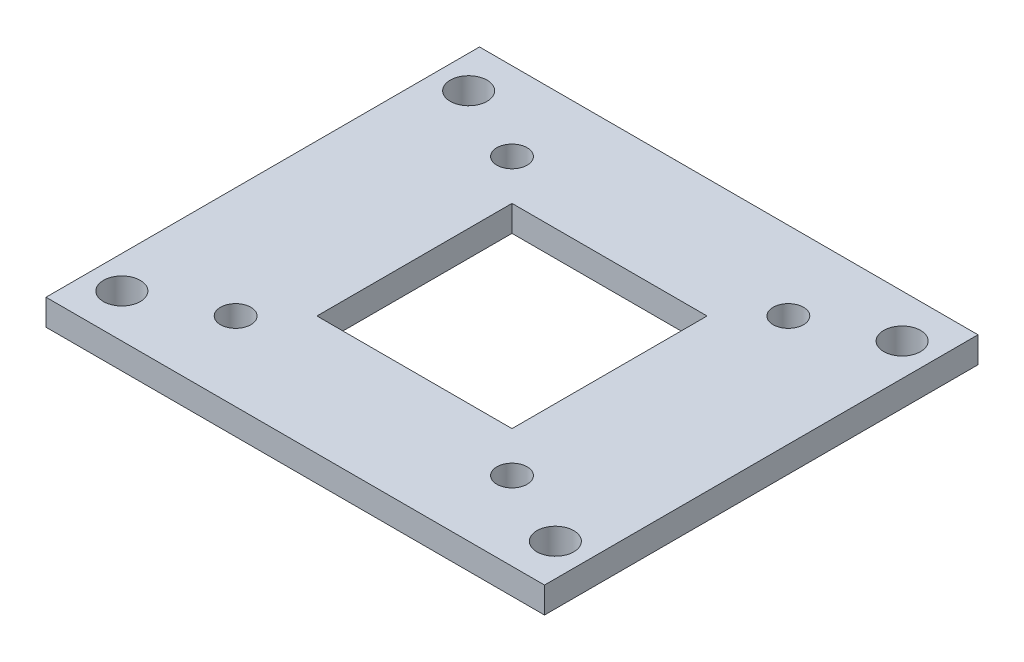
ISO-10303-21;
HEADER;
FILE_DESCRIPTION(('STEP AP214'),'2;1');
FILE_NAME('part.step','',(''),(''),'','','');
FILE_SCHEMA(('AUTOMOTIVE_DESIGN { 1 0 10303 214 1 1 1 1 }'));
ENDSEC;
DATA;
#1=APPLICATION_CONTEXT('core data for automotive mechanical design processes');
#2=APPLICATION_PROTOCOL_DEFINITION('international standard','automotive_design',2000,#1);
#3=PRODUCT_CONTEXT('',#1,'mechanical');
#4=PRODUCT('Part','Part','',(#3));
#5=PRODUCT_RELATED_PRODUCT_CATEGORY('part','',(#4));
#6=PRODUCT_DEFINITION_FORMATION('','',#4);
#7=PRODUCT_DEFINITION_CONTEXT('part definition',#1,'design');
#8=PRODUCT_DEFINITION('design','',#6,#7);
#9=PRODUCT_DEFINITION_SHAPE('','',#8);
#10=(LENGTH_UNIT() NAMED_UNIT(*) SI_UNIT(.MILLI.,.METRE.));
#11=(NAMED_UNIT(*) PLANE_ANGLE_UNIT() SI_UNIT($,.RADIAN.));
#12=(NAMED_UNIT(*) SI_UNIT($,.STERADIAN.) SOLID_ANGLE_UNIT());
#13=UNCERTAINTY_MEASURE_WITH_UNIT(LENGTH_MEASURE(1.E-05),#10,'distance_accuracy_value','');
#14=(GEOMETRIC_REPRESENTATION_CONTEXT(3) GLOBAL_UNCERTAINTY_ASSIGNED_CONTEXT((#13)) GLOBAL_UNIT_ASSIGNED_CONTEXT((#10,
#11,#12)) REPRESENTATION_CONTEXT('',''));
#15=CARTESIAN_POINT('',(0.,0.,0.));
#16=DIRECTION('',(0.,0.,1.));
#17=DIRECTION('',(1.,0.,0.));
#18=AXIS2_PLACEMENT_3D('',#15,#16,#17);
#19=CARTESIAN_POINT('',(-23.,-22.,-53.));
#20=DIRECTION('',(0.,1.,0.));
#21=DIRECTION('',(0.,0.,1.));
#22=AXIS2_PLACEMENT_3D('',#19,#20,#21);
#23=PLANE('',#22);
#24=CARTESIAN_POINT('',(20.,-22.,-17.));
#25=DIRECTION('',(0.,1.,0.));
#26=DIRECTION('',(0.,0.,1.));
#27=AXIS2_PLACEMENT_3D('',#24,#25,#26);
#28=CIRCLE('',#27,1.7);
#29=CARTESIAN_POINT('',(20.,-22.,-15.3));
#30=VERTEX_POINT('',#29);
#31=EDGE_CURVE('E126',#30,#30,#28,.F.);
#32=ORIENTED_EDGE('',*,*,#31,.T.);
#33=EDGE_LOOP('',(#32));
#34=FACE_BOUND('',#33,.T.);
#35=CARTESIAN_POINT('',(12.75,-22.,-20.25));
#36=DIRECTION('',(0.,1.,0.));
#37=DIRECTION('',(0.,0.,1.));
#38=AXIS2_PLACEMENT_3D('',#35,#36,#37);
#39=CIRCLE('',#38,1.4);
#40=CARTESIAN_POINT('',(12.75,-22.,-18.85));
#41=VERTEX_POINT('',#40);
#42=EDGE_CURVE('E129',#41,#41,#39,.F.);
#43=ORIENTED_EDGE('',*,*,#42,.T.);
#44=EDGE_LOOP('',(#43));
#45=FACE_BOUND('',#44,.T.);
#46=CARTESIAN_POINT('',(20.,-22.,-49.));
#47=DIRECTION('',(0.,1.,0.));
#48=DIRECTION('',(0.,0.,1.));
#49=AXIS2_PLACEMENT_3D('',#46,#47,#48);
#50=CIRCLE('',#49,1.7);
#51=CARTESIAN_POINT('',(20.,-22.,-47.3));
#52=VERTEX_POINT('',#51);
#53=EDGE_CURVE('E132',#52,#52,#50,.F.);
#54=ORIENTED_EDGE('',*,*,#53,.T.);
#55=EDGE_LOOP('',(#54));
#56=FACE_BOUND('',#55,.T.);
#57=CARTESIAN_POINT('',(12.75,-22.,-45.75));
#58=DIRECTION('',(0.,1.,0.));
#59=DIRECTION('',(0.,0.,1.));
#60=AXIS2_PLACEMENT_3D('',#57,#58,#59);
#61=CIRCLE('',#60,1.4);
#62=CARTESIAN_POINT('',(12.75,-22.,-44.35));
#63=VERTEX_POINT('',#62);
#64=EDGE_CURVE('E135',#63,#63,#61,.F.);
#65=ORIENTED_EDGE('',*,*,#64,.T.);
#66=EDGE_LOOP('',(#65));
#67=FACE_BOUND('',#66,.T.);
#68=CARTESIAN_POINT('',(-12.75,-22.,-20.25));
#69=DIRECTION('',(0.,1.,0.));
#70=DIRECTION('',(0.,0.,1.));
#71=AXIS2_PLACEMENT_3D('',#68,#69,#70);
#72=CIRCLE('',#71,1.4);
#73=CARTESIAN_POINT('',(-12.75,-22.,-18.85));
#74=VERTEX_POINT('',#73);
#75=EDGE_CURVE('E138',#74,#74,#72,.F.);
#76=ORIENTED_EDGE('',*,*,#75,.T.);
#77=EDGE_LOOP('',(#76));
#78=FACE_BOUND('',#77,.T.);
#79=CARTESIAN_POINT('',(-20.,-22.,-17.));
#80=DIRECTION('',(0.,1.,0.));
#81=DIRECTION('',(0.,0.,1.));
#82=AXIS2_PLACEMENT_3D('',#79,#80,#81);
#83=CIRCLE('',#82,1.7);
#84=CARTESIAN_POINT('',(-20.,-22.,-15.3));
#85=VERTEX_POINT('',#84);
#86=EDGE_CURVE('E141',#85,#85,#83,.F.);
#87=ORIENTED_EDGE('',*,*,#86,.T.);
#88=EDGE_LOOP('',(#87));
#89=FACE_BOUND('',#88,.T.);
#90=DIRECTION('',(1.,0.,0.));
#91=VECTOR('',#90,1.);
#92=CARTESIAN_POINT('',(-9.,-22.,-42.));
#93=LINE('',#92,#91);
#94=CARTESIAN_POINT('',(9.,-22.,-42.));
#95=VERTEX_POINT('',#94);
#96=CARTESIAN_POINT('',(-9.,-22.,-42.));
#97=VERTEX_POINT('',#96);
#98=EDGE_CURVE('E185',#95,#97,#93,.F.);
#99=ORIENTED_EDGE('',*,*,#98,.F.);
#100=DIRECTION('',(0.,0.,-1.));
#101=VECTOR('',#100,1.);
#102=CARTESIAN_POINT('',(9.,-22.,-42.));
#103=LINE('',#102,#101);
#104=CARTESIAN_POINT('',(9.,-22.,-24.));
#105=VERTEX_POINT('',#104);
#106=EDGE_CURVE('E143',#95,#105,#103,.F.);
#107=ORIENTED_EDGE('',*,*,#106,.T.);
#108=DIRECTION('',(1.,0.,0.));
#109=VECTOR('',#108,1.);
#110=CARTESIAN_POINT('',(-9.,-22.,-24.));
#111=LINE('',#110,#109);
#112=CARTESIAN_POINT('',(-9.,-22.,-24.));
#113=VERTEX_POINT('',#112);
#114=EDGE_CURVE('E146',#105,#113,#111,.F.);
#115=ORIENTED_EDGE('',*,*,#114,.T.);
#116=DIRECTION('',(0.,0.,-1.));
#117=VECTOR('',#116,1.);
#118=CARTESIAN_POINT('',(-9.,-22.,-42.));
#119=LINE('',#118,#117);
#120=EDGE_CURVE('E190',#97,#113,#119,.F.);
#121=ORIENTED_EDGE('',*,*,#120,.F.);
#122=EDGE_LOOP('',(#99,#107,#115,#121));
#123=FACE_BOUND('',#122,.T.);
#124=CARTESIAN_POINT('',(-12.75,-22.,-45.75));
#125=DIRECTION('',(0.,1.,0.));
#126=DIRECTION('',(0.,0.,1.));
#127=AXIS2_PLACEMENT_3D('',#124,#125,#126);
#128=CIRCLE('',#127,1.4);
#129=CARTESIAN_POINT('',(-12.75,-22.,-44.35));
#130=VERTEX_POINT('',#129);
#131=EDGE_CURVE('E144',#130,#130,#128,.F.);
#132=ORIENTED_EDGE('',*,*,#131,.T.);
#133=EDGE_LOOP('',(#132));
#134=FACE_BOUND('',#133,.T.);
#135=CARTESIAN_POINT('',(-20.,-22.,-49.));
#136=DIRECTION('',(0.,1.,0.));
#137=DIRECTION('',(0.,0.,1.));
#138=AXIS2_PLACEMENT_3D('',#135,#136,#137);
#139=CIRCLE('',#138,1.7);
#140=CARTESIAN_POINT('',(-20.,-22.,-47.3));
#141=VERTEX_POINT('',#140);
#142=EDGE_CURVE('E18',#141,#141,#139,.F.);
#143=ORIENTED_EDGE('',*,*,#142,.T.);
#144=EDGE_LOOP('',(#143));
#145=FACE_BOUND('',#144,.T.);
#146=DIRECTION('',(1.,0.,0.));
#147=VECTOR('',#146,1.);
#148=CARTESIAN_POINT('',(-23.,-22.,-13.));
#149=LINE('',#148,#147);
#150=CARTESIAN_POINT('',(23.,-22.,-13.));
#151=VERTEX_POINT('',#150);
#152=CARTESIAN_POINT('',(-23.,-22.,-13.));
#153=VERTEX_POINT('',#152);
#154=EDGE_CURVE('E165',#151,#153,#149,.F.);
#155=ORIENTED_EDGE('',*,*,#154,.F.);
#156=DIRECTION('',(0.,0.,-1.));
#157=VECTOR('',#156,1.);
#158=CARTESIAN_POINT('',(23.,-22.,-53.));
#159=LINE('',#158,#157);
#160=CARTESIAN_POINT('',(23.,-22.,-53.));
#161=VERTEX_POINT('',#160);
#162=EDGE_CURVE('E83',#161,#151,#159,.F.);
#163=ORIENTED_EDGE('',*,*,#162,.F.);
#164=DIRECTION('',(1.,0.,0.));
#165=VECTOR('',#164,1.);
#166=CARTESIAN_POINT('',(-23.,-22.,-53.));
#167=LINE('',#166,#165);
#168=CARTESIAN_POINT('',(-23.,-22.,-53.));
#169=VERTEX_POINT('',#168);
#170=EDGE_CURVE('E82',#161,#169,#167,.F.);
#171=ORIENTED_EDGE('',*,*,#170,.T.);
#172=DIRECTION('',(0.,0.,-1.));
#173=VECTOR('',#172,1.);
#174=CARTESIAN_POINT('',(-23.,-22.,-53.));
#175=LINE('',#174,#173);
#176=EDGE_CURVE('E79',#169,#153,#175,.F.);
#177=ORIENTED_EDGE('',*,*,#176,.T.);
#178=EDGE_LOOP('',(#155,#163,#171,#177));
#179=FACE_BOUND('',#178,.T.);
#180=ADVANCED_FACE('F15',(#34,#45,#56,#67,#78,#89,#123,#134,#145,#179),#23,.T.);
#181=CARTESIAN_POINT('',(-23.,-24.4,-53.));
#182=DIRECTION('',(0.,0.,1.));
#183=DIRECTION('',(1.,0.,0.));
#184=AXIS2_PLACEMENT_3D('',#181,#182,#183);
#185=PLANE('',#184);
#186=DIRECTION('',(0.,1.,0.));
#187=VECTOR('',#186,1.);
#188=CARTESIAN_POINT('',(23.,-24.4,-53.));
#189=LINE('',#188,#187);
#190=CARTESIAN_POINT('',(23.,-24.4,-53.));
#191=VERTEX_POINT('',#190);
#192=EDGE_CURVE('E160',#191,#161,#189,.T.);
#193=ORIENTED_EDGE('',*,*,#192,.F.);
#194=DIRECTION('',(1.,0.,0.));
#195=VECTOR('',#194,1.);
#196=CARTESIAN_POINT('',(-23.,-24.4,-53.));
#197=LINE('',#196,#195);
#198=CARTESIAN_POINT('',(-23.,-24.4,-53.));
#199=VERTEX_POINT('',#198);
#200=EDGE_CURVE('E99',#191,#199,#197,.F.);
#201=ORIENTED_EDGE('',*,*,#200,.T.);
#202=DIRECTION('',(0.,1.,0.));
#203=VECTOR('',#202,1.);
#204=CARTESIAN_POINT('',(-23.,-24.4,-53.));
#205=LINE('',#204,#203);
#206=EDGE_CURVE('E88',#199,#169,#205,.T.);
#207=ORIENTED_EDGE('',*,*,#206,.T.);
#208=ORIENTED_EDGE('',*,*,#170,.F.);
#209=EDGE_LOOP('',(#193,#201,#207,#208));
#210=FACE_BOUND('',#209,.T.);
#211=ADVANCED_FACE('F98',(#210),#185,.F.);
#212=CARTESIAN_POINT('',(-23.,-24.4,-53.));
#213=DIRECTION('',(1.,0.,0.));
#214=DIRECTION('',(0.,0.,-1.));
#215=AXIS2_PLACEMENT_3D('',#212,#213,#214);
#216=PLANE('',#215);
#217=ORIENTED_EDGE('',*,*,#176,.F.);
#218=ORIENTED_EDGE('',*,*,#206,.F.);
#219=DIRECTION('',(0.,0.,1.));
#220=VECTOR('',#219,1.);
#221=CARTESIAN_POINT('',(-23.,-24.4,-53.));
#222=LINE('',#221,#220);
#223=CARTESIAN_POINT('',(-23.,-24.4,-13.));
#224=VERTEX_POINT('',#223);
#225=EDGE_CURVE('E173',#199,#224,#222,.T.);
#226=ORIENTED_EDGE('',*,*,#225,.T.);
#227=DIRECTION('',(0.,1.,0.));
#228=VECTOR('',#227,1.);
#229=CARTESIAN_POINT('',(-23.,-24.4,-13.));
#230=LINE('',#229,#228);
#231=EDGE_CURVE('E95',#153,#224,#230,.F.);
#232=ORIENTED_EDGE('',*,*,#231,.F.);
#233=EDGE_LOOP('',(#217,#218,#226,#232));
#234=FACE_BOUND('',#233,.T.);
#235=ADVANCED_FACE('F92',(#234),#216,.F.);
#236=CARTESIAN_POINT('',(-23.,-24.4,-13.));
#237=DIRECTION('',(0.,0.,1.));
#238=DIRECTION('',(1.,0.,0.));
#239=AXIS2_PLACEMENT_3D('',#236,#237,#238);
#240=PLANE('',#239);
#241=DIRECTION('',(0.,1.,0.));
#242=VECTOR('',#241,1.);
#243=CARTESIAN_POINT('',(23.,-24.4,-13.));
#244=LINE('',#243,#242);
#245=CARTESIAN_POINT('',(23.,-24.4,-13.));
#246=VERTEX_POINT('',#245);
#247=EDGE_CURVE('E152',#151,#246,#244,.F.);
#248=ORIENTED_EDGE('',*,*,#247,.F.);
#249=ORIENTED_EDGE('',*,*,#154,.T.);
#250=ORIENTED_EDGE('',*,*,#231,.T.);
#251=DIRECTION('',(1.,0.,0.));
#252=VECTOR('',#251,1.);
#253=CARTESIAN_POINT('',(-23.,-24.4,-13.));
#254=LINE('',#253,#252);
#255=EDGE_CURVE('E170',#224,#246,#254,.T.);
#256=ORIENTED_EDGE('',*,*,#255,.T.);
#257=EDGE_LOOP('',(#248,#249,#250,#256));
#258=FACE_BOUND('',#257,.T.);
#259=ADVANCED_FACE('F169',(#258),#240,.T.);
#260=CARTESIAN_POINT('',(23.,-24.4,-53.));
#261=DIRECTION('',(1.,0.,0.));
#262=DIRECTION('',(0.,0.,-1.));
#263=AXIS2_PLACEMENT_3D('',#260,#261,#262);
#264=PLANE('',#263);
#265=ORIENTED_EDGE('',*,*,#162,.T.);
#266=ORIENTED_EDGE('',*,*,#247,.T.);
#267=DIRECTION('',(0.,0.,1.));
#268=VECTOR('',#267,1.);
#269=CARTESIAN_POINT('',(23.,-24.4,-53.));
#270=LINE('',#269,#268);
#271=EDGE_CURVE('E125',#246,#191,#270,.F.);
#272=ORIENTED_EDGE('',*,*,#271,.T.);
#273=ORIENTED_EDGE('',*,*,#192,.T.);
#274=EDGE_LOOP('',(#265,#266,#272,#273));
#275=FACE_BOUND('',#274,.T.);
#276=ADVANCED_FACE('F211',(#275),#264,.T.);
#277=CARTESIAN_POINT('',(-20.,-20.,-49.));
#278=DIRECTION('',(0.,1.,0.));
#279=DIRECTION('',(0.,0.,1.));
#280=AXIS2_PLACEMENT_3D('',#277,#278,#279);
#281=CYLINDRICAL_SURFACE('',#280,1.7);
#282=CARTESIAN_POINT('',(-20.,-24.4,-49.));
#283=DIRECTION('',(0.,1.,0.));
#284=DIRECTION('',(0.,0.,1.));
#285=AXIS2_PLACEMENT_3D('',#282,#283,#284);
#286=CIRCLE('',#285,1.7);
#287=CARTESIAN_POINT('',(-20.,-24.4,-47.3));
#288=VERTEX_POINT('',#287);
#289=EDGE_CURVE('E122',#288,#288,#286,.F.);
#290=ORIENTED_EDGE('',*,*,#289,.T.);
#291=EDGE_LOOP('',(#290));
#292=FACE_BOUND('',#291,.T.);
#293=ORIENTED_EDGE('',*,*,#142,.F.);
#294=EDGE_LOOP('',(#293));
#295=FACE_BOUND('',#294,.T.);
#296=ADVANCED_FACE('F213',(#292,#295),#281,.F.);
#297=CARTESIAN_POINT('',(-12.75,-20.,-45.75));
#298=DIRECTION('',(0.,1.,0.));
#299=DIRECTION('',(0.,0.,1.));
#300=AXIS2_PLACEMENT_3D('',#297,#298,#299);
#301=CYLINDRICAL_SURFACE('',#300,1.4);
#302=CARTESIAN_POINT('',(-12.75,-24.4,-45.75));
#303=DIRECTION('',(0.,1.,0.));
#304=DIRECTION('',(0.,0.,1.));
#305=AXIS2_PLACEMENT_3D('',#302,#303,#304);
#306=CIRCLE('',#305,1.4);
#307=CARTESIAN_POINT('',(-12.75,-24.4,-44.35));
#308=VERTEX_POINT('',#307);
#309=EDGE_CURVE('E118',#308,#308,#306,.F.);
#310=ORIENTED_EDGE('',*,*,#309,.T.);
#311=EDGE_LOOP('',(#310));
#312=FACE_BOUND('',#311,.T.);
#313=ORIENTED_EDGE('',*,*,#131,.F.);
#314=EDGE_LOOP('',(#313));
#315=FACE_BOUND('',#314,.T.);
#316=ADVANCED_FACE('F220',(#312,#315),#301,.F.);
#317=CARTESIAN_POINT('',(-9.,-25.2,-24.));
#318=DIRECTION('',(0.,0.,1.));
#319=DIRECTION('',(1.,0.,0.));
#320=AXIS2_PLACEMENT_3D('',#317,#318,#319);
#321=PLANE('',#320);
#322=DIRECTION('',(0.,1.,0.));
#323=VECTOR('',#322,1.);
#324=CARTESIAN_POINT('',(9.,-25.2,-24.));
#325=LINE('',#324,#323);
#326=CARTESIAN_POINT('',(9.,-24.4,-24.));
#327=VERTEX_POINT('',#326);
#328=EDGE_CURVE('E182',#105,#327,#325,.F.);
#329=ORIENTED_EDGE('',*,*,#328,.T.);
#330=DIRECTION('',(1.,0.,0.));
#331=VECTOR('',#330,1.);
#332=CARTESIAN_POINT('',(-23.,-24.4,-24.));
#333=LINE('',#332,#331);
#334=CARTESIAN_POINT('',(-9.,-24.4,-24.));
#335=VERTEX_POINT('',#334);
#336=EDGE_CURVE('E121',#327,#335,#333,.F.);
#337=ORIENTED_EDGE('',*,*,#336,.T.);
#338=DIRECTION('',(0.,1.,0.));
#339=VECTOR('',#338,1.);
#340=CARTESIAN_POINT('',(-9.,-25.2,-24.));
#341=LINE('',#340,#339);
#342=EDGE_CURVE('E149',#113,#335,#341,.F.);
#343=ORIENTED_EDGE('',*,*,#342,.F.);
#344=ORIENTED_EDGE('',*,*,#114,.F.);
#345=EDGE_LOOP('',(#329,#337,#343,#344));
#346=FACE_BOUND('',#345,.T.);
#347=ADVANCED_FACE('F207',(#346),#321,.F.);
#348=CARTESIAN_POINT('',(-9.,-25.2,-42.));
#349=DIRECTION('',(1.,0.,0.));
#350=DIRECTION('',(0.,0.,-1.));
#351=AXIS2_PLACEMENT_3D('',#348,#349,#350);
#352=PLANE('',#351);
#353=DIRECTION('',(0.,1.,0.));
#354=VECTOR('',#353,1.);
#355=CARTESIAN_POINT('',(-9.,-25.2,-42.));
#356=LINE('',#355,#354);
#357=CARTESIAN_POINT('',(-9.,-24.4,-42.));
#358=VERTEX_POINT('',#357);
#359=EDGE_CURVE('E188',#97,#358,#356,.F.);
#360=ORIENTED_EDGE('',*,*,#359,.F.);
#361=ORIENTED_EDGE('',*,*,#120,.T.);
#362=ORIENTED_EDGE('',*,*,#342,.T.);
#363=DIRECTION('',(0.,0.,1.));
#364=VECTOR('',#363,1.);
#365=CARTESIAN_POINT('',(-9.,-24.4,-53.));
#366=LINE('',#365,#364);
#367=EDGE_CURVE('E198',#335,#358,#366,.F.);
#368=ORIENTED_EDGE('',*,*,#367,.T.);
#369=EDGE_LOOP('',(#360,#361,#362,#368));
#370=FACE_BOUND('',#369,.T.);
#371=ADVANCED_FACE('F197',(#370),#352,.T.);
#372=CARTESIAN_POINT('',(-9.,-25.2,-42.));
#373=DIRECTION('',(0.,0.,1.));
#374=DIRECTION('',(1.,0.,0.));
#375=AXIS2_PLACEMENT_3D('',#372,#373,#374);
#376=PLANE('',#375);
#377=DIRECTION('',(0.,1.,0.));
#378=VECTOR('',#377,1.);
#379=CARTESIAN_POINT('',(9.,-25.2,-42.));
#380=LINE('',#379,#378);
#381=CARTESIAN_POINT('',(9.,-24.4,-42.));
#382=VERTEX_POINT('',#381);
#383=EDGE_CURVE('E33',#382,#95,#380,.T.);
#384=ORIENTED_EDGE('',*,*,#383,.T.);
#385=ORIENTED_EDGE('',*,*,#98,.T.);
#386=ORIENTED_EDGE('',*,*,#359,.T.);
#387=DIRECTION('',(1.,0.,0.));
#388=VECTOR('',#387,1.);
#389=CARTESIAN_POINT('',(-23.,-24.4,-42.));
#390=LINE('',#389,#388);
#391=EDGE_CURVE('E205',#358,#382,#390,.T.);
#392=ORIENTED_EDGE('',*,*,#391,.T.);
#393=EDGE_LOOP('',(#384,#385,#386,#392));
#394=FACE_BOUND('',#393,.T.);
#395=ADVANCED_FACE('F259',(#394),#376,.T.);
#396=CARTESIAN_POINT('',(9.,-25.2,-42.));
#397=DIRECTION('',(1.,0.,0.));
#398=DIRECTION('',(0.,0.,-1.));
#399=AXIS2_PLACEMENT_3D('',#396,#397,#398);
#400=PLANE('',#399);
#401=ORIENTED_EDGE('',*,*,#383,.F.);
#402=DIRECTION('',(0.,0.,1.));
#403=VECTOR('',#402,1.);
#404=CARTESIAN_POINT('',(9.,-24.4,-53.));
#405=LINE('',#404,#403);
#406=EDGE_CURVE('E117',#382,#327,#405,.T.);
#407=ORIENTED_EDGE('',*,*,#406,.T.);
#408=ORIENTED_EDGE('',*,*,#328,.F.);
#409=ORIENTED_EDGE('',*,*,#106,.F.);
#410=EDGE_LOOP('',(#401,#407,#408,#409));
#411=FACE_BOUND('',#410,.T.);
#412=ADVANCED_FACE('F255',(#411),#400,.F.);
#413=CARTESIAN_POINT('',(-20.,-20.,-17.));
#414=DIRECTION('',(0.,1.,0.));
#415=DIRECTION('',(0.,0.,1.));
#416=AXIS2_PLACEMENT_3D('',#413,#414,#415);
#417=CYLINDRICAL_SURFACE('',#416,1.7);
#418=CARTESIAN_POINT('',(-20.,-24.4,-17.));
#419=DIRECTION('',(0.,1.,0.));
#420=DIRECTION('',(0.,0.,1.));
#421=AXIS2_PLACEMENT_3D('',#418,#419,#420);
#422=CIRCLE('',#421,1.7);
#423=CARTESIAN_POINT('',(-20.,-24.4,-15.3));
#424=VERTEX_POINT('',#423);
#425=EDGE_CURVE('E114',#424,#424,#422,.F.);
#426=ORIENTED_EDGE('',*,*,#425,.T.);
#427=EDGE_LOOP('',(#426));
#428=FACE_BOUND('',#427,.T.);
#429=ORIENTED_EDGE('',*,*,#86,.F.);
#430=EDGE_LOOP('',(#429));
#431=FACE_BOUND('',#430,.T.);
#432=ADVANCED_FACE('F251',(#428,#431),#417,.F.);
#433=CARTESIAN_POINT('',(-12.75,-20.,-20.25));
#434=DIRECTION('',(0.,1.,0.));
#435=DIRECTION('',(0.,0.,1.));
#436=AXIS2_PLACEMENT_3D('',#433,#434,#435);
#437=CYLINDRICAL_SURFACE('',#436,1.4);
#438=CARTESIAN_POINT('',(-12.75,-24.4,-20.25));
#439=DIRECTION('',(0.,1.,0.));
#440=DIRECTION('',(0.,0.,1.));
#441=AXIS2_PLACEMENT_3D('',#438,#439,#440);
#442=CIRCLE('',#441,1.4);
#443=CARTESIAN_POINT('',(-12.75,-24.4,-18.85));
#444=VERTEX_POINT('',#443);
#445=EDGE_CURVE('E111',#444,#444,#442,.F.);
#446=ORIENTED_EDGE('',*,*,#445,.T.);
#447=EDGE_LOOP('',(#446));
#448=FACE_BOUND('',#447,.T.);
#449=ORIENTED_EDGE('',*,*,#75,.F.);
#450=EDGE_LOOP('',(#449));
#451=FACE_BOUND('',#450,.T.);
#452=ADVANCED_FACE('F247',(#448,#451),#437,.F.);
#453=CARTESIAN_POINT('',(12.75,-20.,-45.75));
#454=DIRECTION('',(0.,1.,0.));
#455=DIRECTION('',(0.,0.,1.));
#456=AXIS2_PLACEMENT_3D('',#453,#454,#455);
#457=CYLINDRICAL_SURFACE('',#456,1.4);
#458=CARTESIAN_POINT('',(12.75,-24.4,-45.75));
#459=DIRECTION('',(0.,1.,0.));
#460=DIRECTION('',(0.,0.,1.));
#461=AXIS2_PLACEMENT_3D('',#458,#459,#460);
#462=CIRCLE('',#461,1.4);
#463=CARTESIAN_POINT('',(12.75,-24.4,-44.35));
#464=VERTEX_POINT('',#463);
#465=EDGE_CURVE('E108',#464,#464,#462,.F.);
#466=ORIENTED_EDGE('',*,*,#465,.T.);
#467=EDGE_LOOP('',(#466));
#468=FACE_BOUND('',#467,.T.);
#469=ORIENTED_EDGE('',*,*,#64,.F.);
#470=EDGE_LOOP('',(#469));
#471=FACE_BOUND('',#470,.T.);
#472=ADVANCED_FACE('F243',(#468,#471),#457,.F.);
#473=CARTESIAN_POINT('',(20.,-20.,-49.));
#474=DIRECTION('',(0.,1.,0.));
#475=DIRECTION('',(0.,0.,1.));
#476=AXIS2_PLACEMENT_3D('',#473,#474,#475);
#477=CYLINDRICAL_SURFACE('',#476,1.7);
#478=CARTESIAN_POINT('',(20.,-24.4,-49.));
#479=DIRECTION('',(0.,1.,0.));
#480=DIRECTION('',(0.,0.,1.));
#481=AXIS2_PLACEMENT_3D('',#478,#479,#480);
#482=CIRCLE('',#481,1.7);
#483=CARTESIAN_POINT('',(20.,-24.4,-47.3));
#484=VERTEX_POINT('',#483);
#485=EDGE_CURVE('E105',#484,#484,#482,.F.);
#486=ORIENTED_EDGE('',*,*,#485,.T.);
#487=EDGE_LOOP('',(#486));
#488=FACE_BOUND('',#487,.T.);
#489=ORIENTED_EDGE('',*,*,#53,.F.);
#490=EDGE_LOOP('',(#489));
#491=FACE_BOUND('',#490,.T.);
#492=ADVANCED_FACE('F239',(#488,#491),#477,.F.);
#493=CARTESIAN_POINT('',(12.75,-20.,-20.25));
#494=DIRECTION('',(0.,1.,0.));
#495=DIRECTION('',(0.,0.,1.));
#496=AXIS2_PLACEMENT_3D('',#493,#494,#495);
#497=CYLINDRICAL_SURFACE('',#496,1.4);
#498=CARTESIAN_POINT('',(12.75,-24.4,-20.25));
#499=DIRECTION('',(0.,1.,0.));
#500=DIRECTION('',(0.,0.,1.));
#501=AXIS2_PLACEMENT_3D('',#498,#499,#500);
#502=CIRCLE('',#501,1.4);
#503=CARTESIAN_POINT('',(12.75,-24.4,-18.85));
#504=VERTEX_POINT('',#503);
#505=EDGE_CURVE('E24',#504,#504,#502,.F.);
#506=ORIENTED_EDGE('',*,*,#505,.T.);
#507=EDGE_LOOP('',(#506));
#508=FACE_BOUND('',#507,.T.);
#509=ORIENTED_EDGE('',*,*,#42,.F.);
#510=EDGE_LOOP('',(#509));
#511=FACE_BOUND('',#510,.T.);
#512=ADVANCED_FACE('F231',(#508,#511),#497,.F.);
#513=CARTESIAN_POINT('',(20.,-20.,-17.));
#514=DIRECTION('',(0.,1.,0.));
#515=DIRECTION('',(0.,0.,1.));
#516=AXIS2_PLACEMENT_3D('',#513,#514,#515);
#517=CYLINDRICAL_SURFACE('',#516,1.7);
#518=CARTESIAN_POINT('',(20.,-24.4,-17.));
#519=DIRECTION('',(0.,1.,0.));
#520=DIRECTION('',(0.,0.,1.));
#521=AXIS2_PLACEMENT_3D('',#518,#519,#520);
#522=CIRCLE('',#521,1.7);
#523=CARTESIAN_POINT('',(20.,-24.4,-15.3));
#524=VERTEX_POINT('',#523);
#525=EDGE_CURVE('E9',#524,#524,#522,.F.);
#526=ORIENTED_EDGE('',*,*,#525,.T.);
#527=EDGE_LOOP('',(#526));
#528=FACE_BOUND('',#527,.T.);
#529=ORIENTED_EDGE('',*,*,#31,.F.);
#530=EDGE_LOOP('',(#529));
#531=FACE_BOUND('',#530,.T.);
#532=ADVANCED_FACE('F225',(#528,#531),#517,.F.);
#533=CARTESIAN_POINT('',(-23.,-24.4,-53.));
#534=DIRECTION('',(0.,1.,0.));
#535=DIRECTION('',(0.,0.,1.));
#536=AXIS2_PLACEMENT_3D('',#533,#534,#535);
#537=PLANE('',#536);
#538=ORIENTED_EDGE('',*,*,#525,.F.);
#539=EDGE_LOOP('',(#538));
#540=FACE_BOUND('',#539,.T.);
#541=ORIENTED_EDGE('',*,*,#505,.F.);
#542=EDGE_LOOP('',(#541));
#543=FACE_BOUND('',#542,.T.);
#544=ORIENTED_EDGE('',*,*,#485,.F.);
#545=EDGE_LOOP('',(#544));
#546=FACE_BOUND('',#545,.T.);
#547=ORIENTED_EDGE('',*,*,#465,.F.);
#548=EDGE_LOOP('',(#547));
#549=FACE_BOUND('',#548,.T.);
#550=ORIENTED_EDGE('',*,*,#445,.F.);
#551=EDGE_LOOP('',(#550));
#552=FACE_BOUND('',#551,.T.);
#553=ORIENTED_EDGE('',*,*,#425,.F.);
#554=EDGE_LOOP('',(#553));
#555=FACE_BOUND('',#554,.T.);
#556=ORIENTED_EDGE('',*,*,#391,.F.);
#557=ORIENTED_EDGE('',*,*,#367,.F.);
#558=ORIENTED_EDGE('',*,*,#336,.F.);
#559=ORIENTED_EDGE('',*,*,#406,.F.);
#560=EDGE_LOOP('',(#556,#557,#558,#559));
#561=FACE_BOUND('',#560,.T.);
#562=ORIENTED_EDGE('',*,*,#309,.F.);
#563=EDGE_LOOP('',(#562));
#564=FACE_BOUND('',#563,.T.);
#565=ORIENTED_EDGE('',*,*,#289,.F.);
#566=EDGE_LOOP('',(#565));
#567=FACE_BOUND('',#566,.T.);
#568=ORIENTED_EDGE('',*,*,#255,.F.);
#569=ORIENTED_EDGE('',*,*,#225,.F.);
#570=ORIENTED_EDGE('',*,*,#200,.F.);
#571=ORIENTED_EDGE('',*,*,#271,.F.);
#572=EDGE_LOOP('',(#568,#569,#570,#571));
#573=FACE_BOUND('',#572,.T.);
#574=ADVANCED_FACE('F172',(#540,#543,#546,#549,#552,#555,#561,#564,#567,#573),#537,.F.);
#575=CLOSED_SHELL('',(#180,#211,#235,#259,#276,#296,#316,#347,#371,#395,#412,#432,#452,#472,
#492,#512,#532,#574));
#576=MANIFOLD_SOLID_BREP('B1',#575);
#577=ADVANCED_BREP_SHAPE_REPRESENTATION('',(#18,#576),#14);
#578=SHAPE_DEFINITION_REPRESENTATION(#9,#577);
ENDSEC;
END-ISO-10303-21;
